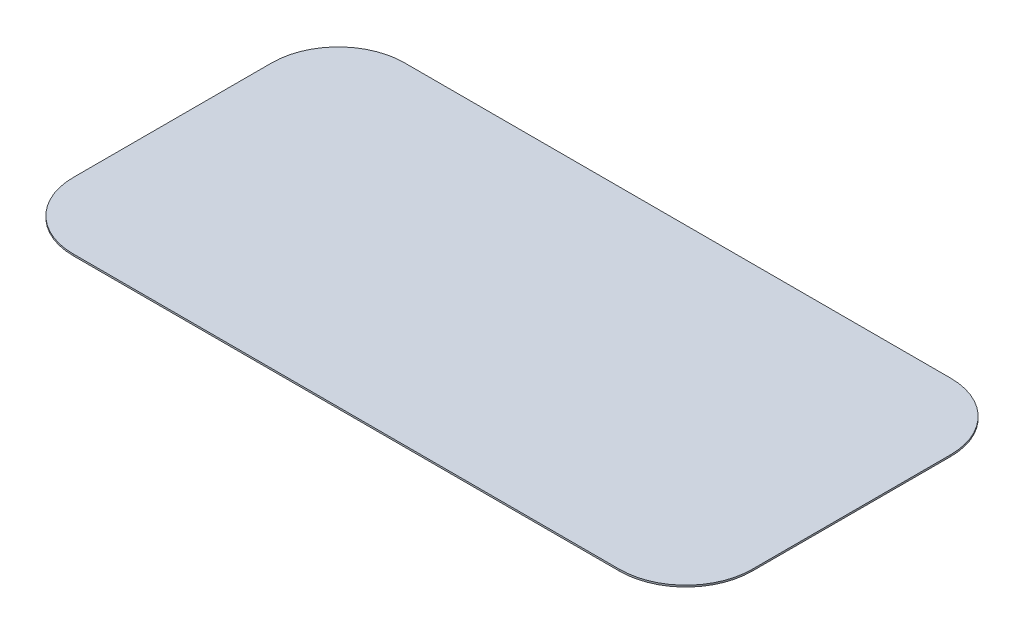
ISO-10303-21;
HEADER;
FILE_DESCRIPTION(('STEP AP214'),'2;1');
FILE_NAME('part.step','',(''),(''),'','','');
FILE_SCHEMA(('AUTOMOTIVE_DESIGN { 1 0 10303 214 1 1 1 1 }'));
ENDSEC;
DATA;
#1=APPLICATION_CONTEXT('core data for automotive mechanical design processes');
#2=APPLICATION_PROTOCOL_DEFINITION('international standard','automotive_design',2000,#1);
#3=PRODUCT_CONTEXT('',#1,'mechanical');
#4=PRODUCT('Part','Part','',(#3));
#5=PRODUCT_RELATED_PRODUCT_CATEGORY('part','',(#4));
#6=PRODUCT_DEFINITION_FORMATION('','',#4);
#7=PRODUCT_DEFINITION_CONTEXT('part definition',#1,'design');
#8=PRODUCT_DEFINITION('design','',#6,#7);
#9=PRODUCT_DEFINITION_SHAPE('','',#8);
#10=(LENGTH_UNIT() NAMED_UNIT(*) SI_UNIT(.MILLI.,.METRE.));
#11=(NAMED_UNIT(*) PLANE_ANGLE_UNIT() SI_UNIT($,.RADIAN.));
#12=(NAMED_UNIT(*) SI_UNIT($,.STERADIAN.) SOLID_ANGLE_UNIT());
#13=UNCERTAINTY_MEASURE_WITH_UNIT(LENGTH_MEASURE(1.E-05),#10,'distance_accuracy_value','');
#14=(GEOMETRIC_REPRESENTATION_CONTEXT(3) GLOBAL_UNCERTAINTY_ASSIGNED_CONTEXT((#13)) GLOBAL_UNIT_ASSIGNED_CONTEXT((#10,
#11,#12)) REPRESENTATION_CONTEXT('',''));
#15=CARTESIAN_POINT('',(0.,0.,0.));
#16=DIRECTION('',(0.,0.,1.));
#17=DIRECTION('',(1.,0.,0.));
#18=AXIS2_PLACEMENT_3D('',#15,#16,#17);
#19=CARTESIAN_POINT('',(0.,0.05,0.));
#20=DIRECTION('',(1.,0.,0.));
#21=DIRECTION('',(0.,0.,-1.));
#22=AXIS2_PLACEMENT_3D('',#19,#20,#21);
#23=PLANE('',#22);
#24=DIRECTION('',(0.,0.,1.));
#25=VECTOR('',#24,1.);
#26=CARTESIAN_POINT('',(0.,0.05,0.));
#27=LINE('',#26,#25);
#28=CARTESIAN_POINT('',(0.,0.05,-8.));
#29=VERTEX_POINT('',#28);
#30=CARTESIAN_POINT('',(0.,0.05,-2.));
#31=VERTEX_POINT('',#30);
#32=EDGE_CURVE('E120',#29,#31,#27,.T.);
#33=ORIENTED_EDGE('',*,*,#32,.F.);
#34=DIRECTION('',(0.,-1.,0.));
#35=VECTOR('',#34,1.);
#36=CARTESIAN_POINT('',(0.,0.05,-8.));
#37=LINE('',#36,#35);
#38=CARTESIAN_POINT('',(0.,0.,-8.));
#39=VERTEX_POINT('',#38);
#40=EDGE_CURVE('E105',#29,#39,#37,.T.);
#41=ORIENTED_EDGE('',*,*,#40,.T.);
#42=DIRECTION('',(0.,0.,1.));
#43=VECTOR('',#42,1.);
#44=CARTESIAN_POINT('',(0.,0.,0.));
#45=LINE('',#44,#43);
#46=CARTESIAN_POINT('',(0.,0.,-2.));
#47=VERTEX_POINT('',#46);
#48=EDGE_CURVE('E117',#39,#47,#45,.T.);
#49=ORIENTED_EDGE('',*,*,#48,.T.);
#50=DIRECTION('',(0.,-1.,0.));
#51=VECTOR('',#50,1.);
#52=CARTESIAN_POINT('',(0.,0.05,-2.));
#53=LINE('',#52,#51);
#54=EDGE_CURVE('E122',#47,#31,#53,.F.);
#55=ORIENTED_EDGE('',*,*,#54,.T.);
#56=EDGE_LOOP('',(#33,#41,#49,#55));
#57=FACE_BOUND('',#56,.T.);
#58=ADVANCED_FACE('F35',(#57),#23,.F.);
#59=CARTESIAN_POINT('',(0.,0.05,0.));
#60=DIRECTION('',(0.,0.,-1.));
#61=DIRECTION('',(-1.,0.,0.));
#62=AXIS2_PLACEMENT_3D('',#59,#60,#61);
#63=PLANE('',#62);
#64=DIRECTION('',(1.,0.,0.));
#65=VECTOR('',#64,1.);
#66=CARTESIAN_POINT('',(0.,0.05,0.));
#67=LINE('',#66,#65);
#68=CARTESIAN_POINT('',(2.,0.05,0.));
#69=VERTEX_POINT('',#68);
#70=CARTESIAN_POINT('',(18.5,0.05,0.));
#71=VERTEX_POINT('',#70);
#72=EDGE_CURVE('E162',#69,#71,#67,.T.);
#73=ORIENTED_EDGE('',*,*,#72,.F.);
#74=DIRECTION('',(0.,-1.,0.));
#75=VECTOR('',#74,1.);
#76=CARTESIAN_POINT('',(2.,0.05,0.));
#77=LINE('',#76,#75);
#78=CARTESIAN_POINT('',(2.,0.,0.));
#79=VERTEX_POINT('',#78);
#80=EDGE_CURVE('E155',#69,#79,#77,.T.);
#81=ORIENTED_EDGE('',*,*,#80,.T.);
#82=DIRECTION('',(1.,0.,0.));
#83=VECTOR('',#82,1.);
#84=CARTESIAN_POINT('',(0.,0.,0.));
#85=LINE('',#84,#83);
#86=CARTESIAN_POINT('',(18.5,0.,0.));
#87=VERTEX_POINT('',#86);
#88=EDGE_CURVE('E126',#79,#87,#85,.T.);
#89=ORIENTED_EDGE('',*,*,#88,.T.);
#90=DIRECTION('',(0.,-1.,0.));
#91=VECTOR('',#90,1.);
#92=CARTESIAN_POINT('',(18.5,0.05,0.));
#93=LINE('',#92,#91);
#94=EDGE_CURVE('E153',#87,#71,#93,.F.);
#95=ORIENTED_EDGE('',*,*,#94,.T.);
#96=EDGE_LOOP('',(#73,#81,#89,#95));
#97=FACE_BOUND('',#96,.T.);
#98=ADVANCED_FACE('F160',(#97),#63,.F.);
#99=CARTESIAN_POINT('',(20.5,0.05,0.));
#100=DIRECTION('',(-1.,0.,0.));
#101=DIRECTION('',(0.,0.,1.));
#102=AXIS2_PLACEMENT_3D('',#99,#100,#101);
#103=PLANE('',#102);
#104=DIRECTION('',(0.,0.,-1.));
#105=VECTOR('',#104,1.);
#106=CARTESIAN_POINT('',(20.5,0.05,0.));
#107=LINE('',#106,#105);
#108=CARTESIAN_POINT('',(20.5,0.05,-2.));
#109=VERTEX_POINT('',#108);
#110=CARTESIAN_POINT('',(20.5,0.05,-8.));
#111=VERTEX_POINT('',#110);
#112=EDGE_CURVE('E170',#109,#111,#107,.T.);
#113=ORIENTED_EDGE('',*,*,#112,.F.);
#114=DIRECTION('',(0.,-1.,0.));
#115=VECTOR('',#114,1.);
#116=CARTESIAN_POINT('',(20.5,0.05,-2.));
#117=LINE('',#116,#115);
#118=CARTESIAN_POINT('',(20.5,0.,-2.));
#119=VERTEX_POINT('',#118);
#120=EDGE_CURVE('E11',#109,#119,#117,.T.);
#121=ORIENTED_EDGE('',*,*,#120,.T.);
#122=DIRECTION('',(0.,0.,-1.));
#123=VECTOR('',#122,1.);
#124=CARTESIAN_POINT('',(20.5,0.,0.));
#125=LINE('',#124,#123);
#126=CARTESIAN_POINT('',(20.5,0.,-8.));
#127=VERTEX_POINT('',#126);
#128=EDGE_CURVE('E129',#119,#127,#125,.T.);
#129=ORIENTED_EDGE('',*,*,#128,.T.);
#130=DIRECTION('',(0.,-1.,0.));
#131=VECTOR('',#130,1.);
#132=CARTESIAN_POINT('',(20.5,0.05,-8.));
#133=LINE('',#132,#131);
#134=EDGE_CURVE('E43',#127,#111,#133,.F.);
#135=ORIENTED_EDGE('',*,*,#134,.T.);
#136=EDGE_LOOP('',(#113,#121,#129,#135));
#137=FACE_BOUND('',#136,.T.);
#138=ADVANCED_FACE('F169',(#137),#103,.F.);
#139=CARTESIAN_POINT('',(0.,0.05,-10.));
#140=DIRECTION('',(0.,0.,1.));
#141=DIRECTION('',(1.,0.,0.));
#142=AXIS2_PLACEMENT_3D('',#139,#140,#141);
#143=PLANE('',#142);
#144=DIRECTION('',(-1.,0.,0.));
#145=VECTOR('',#144,1.);
#146=CARTESIAN_POINT('',(0.,0.,-10.));
#147=LINE('',#146,#145);
#148=CARTESIAN_POINT('',(18.5,0.,-10.));
#149=VERTEX_POINT('',#148);
#150=CARTESIAN_POINT('',(1.99999999999999,0.,-10.));
#151=VERTEX_POINT('',#150);
#152=EDGE_CURVE('E136',#149,#151,#147,.T.);
#153=ORIENTED_EDGE('',*,*,#152,.T.);
#154=DIRECTION('',(0.,-1.,0.));
#155=VECTOR('',#154,1.);
#156=CARTESIAN_POINT('',(2.,0.05,-10.));
#157=LINE('',#156,#155);
#158=CARTESIAN_POINT('',(1.99999999999999,0.05,-10.));
#159=VERTEX_POINT('',#158);
#160=EDGE_CURVE('E106',#151,#159,#157,.F.);
#161=ORIENTED_EDGE('',*,*,#160,.T.);
#162=DIRECTION('',(-1.,0.,0.));
#163=VECTOR('',#162,1.);
#164=CARTESIAN_POINT('',(0.,0.05,-10.));
#165=LINE('',#164,#163);
#166=CARTESIAN_POINT('',(18.5,0.05,-10.));
#167=VERTEX_POINT('',#166);
#168=EDGE_CURVE('E132',#167,#159,#165,.T.);
#169=ORIENTED_EDGE('',*,*,#168,.F.);
#170=DIRECTION('',(0.,-1.,0.));
#171=VECTOR('',#170,1.);
#172=CARTESIAN_POINT('',(18.5,0.05,-10.));
#173=LINE('',#172,#171);
#174=EDGE_CURVE('E111',#167,#149,#173,.T.);
#175=ORIENTED_EDGE('',*,*,#174,.T.);
#176=EDGE_LOOP('',(#153,#161,#169,#175));
#177=FACE_BOUND('',#176,.T.);
#178=ADVANCED_FACE('F193',(#177),#143,.F.);
#179=CARTESIAN_POINT('',(0.,0.05,0.));
#180=DIRECTION('',(0.,-1.,0.));
#181=DIRECTION('',(0.,0.,-1.));
#182=AXIS2_PLACEMENT_3D('',#179,#180,#181);
#183=PLANE('',#182);
#184=ORIENTED_EDGE('',*,*,#168,.T.);
#185=CARTESIAN_POINT('',(2.,0.05,-8.));
#186=DIRECTION('',(0.,-1.,0.));
#187=DIRECTION('',(0.,0.,-1.));
#188=AXIS2_PLACEMENT_3D('',#185,#186,#187);
#189=CIRCLE('',#188,2.);
#190=EDGE_CURVE('E151',#159,#29,#189,.F.);
#191=ORIENTED_EDGE('',*,*,#190,.T.);
#192=ORIENTED_EDGE('',*,*,#32,.T.);
#193=CARTESIAN_POINT('',(2.,0.05,-2.));
#194=DIRECTION('',(0.,-1.,0.));
#195=DIRECTION('',(0.,0.,-1.));
#196=AXIS2_PLACEMENT_3D('',#193,#194,#195);
#197=CIRCLE('',#196,2.);
#198=EDGE_CURVE('E149',#31,#69,#197,.F.);
#199=ORIENTED_EDGE('',*,*,#198,.T.);
#200=ORIENTED_EDGE('',*,*,#72,.T.);
#201=CARTESIAN_POINT('',(18.5,0.05,-2.));
#202=DIRECTION('',(0.,-1.,0.));
#203=DIRECTION('',(0.,0.,-1.));
#204=AXIS2_PLACEMENT_3D('',#201,#202,#203);
#205=CIRCLE('',#204,2.);
#206=EDGE_CURVE('E56',#71,#109,#205,.F.);
#207=ORIENTED_EDGE('',*,*,#206,.T.);
#208=ORIENTED_EDGE('',*,*,#112,.T.);
#209=CARTESIAN_POINT('',(18.5,0.05,-8.));
#210=DIRECTION('',(0.,-1.,0.));
#211=DIRECTION('',(0.,0.,-1.));
#212=AXIS2_PLACEMENT_3D('',#209,#210,#211);
#213=CIRCLE('',#212,2.);
#214=EDGE_CURVE('E146',#111,#167,#213,.F.);
#215=ORIENTED_EDGE('',*,*,#214,.T.);
#216=EDGE_LOOP('',(#184,#191,#192,#199,#200,#207,#208,#215));
#217=FACE_BOUND('',#216,.T.);
#218=ADVANCED_FACE('F175',(#217),#183,.F.);
#219=CARTESIAN_POINT('',(0.,0.,0.));
#220=DIRECTION('',(0.,-1.,0.));
#221=DIRECTION('',(0.,0.,-1.));
#222=AXIS2_PLACEMENT_3D('',#219,#220,#221);
#223=PLANE('',#222);
#224=ORIENTED_EDGE('',*,*,#48,.F.);
#225=CARTESIAN_POINT('',(2.,0.,-8.));
#226=DIRECTION('',(0.,-1.,0.));
#227=DIRECTION('',(0.,0.,-1.));
#228=AXIS2_PLACEMENT_3D('',#225,#226,#227);
#229=CIRCLE('',#228,2.);
#230=EDGE_CURVE('E101',#39,#151,#229,.T.);
#231=ORIENTED_EDGE('',*,*,#230,.T.);
#232=ORIENTED_EDGE('',*,*,#152,.F.);
#233=CARTESIAN_POINT('',(18.5,0.,-8.));
#234=DIRECTION('',(0.,-1.,0.));
#235=DIRECTION('',(0.,0.,-1.));
#236=AXIS2_PLACEMENT_3D('',#233,#234,#235);
#237=CIRCLE('',#236,2.);
#238=EDGE_CURVE('E121',#149,#127,#237,.T.);
#239=ORIENTED_EDGE('',*,*,#238,.T.);
#240=ORIENTED_EDGE('',*,*,#128,.F.);
#241=CARTESIAN_POINT('',(18.5,0.,-2.));
#242=DIRECTION('',(0.,-1.,0.));
#243=DIRECTION('',(0.,0.,-1.));
#244=AXIS2_PLACEMENT_3D('',#241,#242,#243);
#245=CIRCLE('',#244,2.);
#246=EDGE_CURVE('E140',#119,#87,#245,.T.);
#247=ORIENTED_EDGE('',*,*,#246,.T.);
#248=ORIENTED_EDGE('',*,*,#88,.F.);
#249=CARTESIAN_POINT('',(2.,0.,-2.));
#250=DIRECTION('',(0.,-1.,0.));
#251=DIRECTION('',(0.,0.,-1.));
#252=AXIS2_PLACEMENT_3D('',#249,#250,#251);
#253=CIRCLE('',#252,2.);
#254=EDGE_CURVE('E112',#79,#47,#253,.T.);
#255=ORIENTED_EDGE('',*,*,#254,.T.);
#256=EDGE_LOOP('',(#224,#231,#232,#239,#240,#247,#248,#255));
#257=FACE_BOUND('',#256,.T.);
#258=ADVANCED_FACE('F124',(#257),#223,.T.);
#259=CARTESIAN_POINT('',(2.,0.05,-8.));
#260=DIRECTION('',(0.,-1.,0.));
#261=DIRECTION('',(0.,0.,-1.));
#262=AXIS2_PLACEMENT_3D('',#259,#260,#261);
#263=CYLINDRICAL_SURFACE('',#262,2.);
#264=ORIENTED_EDGE('',*,*,#190,.F.);
#265=ORIENTED_EDGE('',*,*,#160,.F.);
#266=ORIENTED_EDGE('',*,*,#230,.F.);
#267=ORIENTED_EDGE('',*,*,#40,.F.);
#268=EDGE_LOOP('',(#264,#265,#266,#267));
#269=FACE_BOUND('',#268,.T.);
#270=ADVANCED_FACE('F104',(#269),#263,.T.);
#271=CARTESIAN_POINT('',(2.,0.05,-2.));
#272=DIRECTION('',(0.,-1.,0.));
#273=DIRECTION('',(0.,0.,-1.));
#274=AXIS2_PLACEMENT_3D('',#271,#272,#273);
#275=CYLINDRICAL_SURFACE('',#274,2.);
#276=ORIENTED_EDGE('',*,*,#198,.F.);
#277=ORIENTED_EDGE('',*,*,#54,.F.);
#278=ORIENTED_EDGE('',*,*,#254,.F.);
#279=ORIENTED_EDGE('',*,*,#80,.F.);
#280=EDGE_LOOP('',(#276,#277,#278,#279));
#281=FACE_BOUND('',#280,.T.);
#282=ADVANCED_FACE('F176',(#281),#275,.T.);
#283=CARTESIAN_POINT('',(18.5,0.05,-2.));
#284=DIRECTION('',(0.,-1.,0.));
#285=DIRECTION('',(0.,0.,-1.));
#286=AXIS2_PLACEMENT_3D('',#283,#284,#285);
#287=CYLINDRICAL_SURFACE('',#286,2.);
#288=ORIENTED_EDGE('',*,*,#206,.F.);
#289=ORIENTED_EDGE('',*,*,#94,.F.);
#290=ORIENTED_EDGE('',*,*,#246,.F.);
#291=ORIENTED_EDGE('',*,*,#120,.F.);
#292=EDGE_LOOP('',(#288,#289,#290,#291));
#293=FACE_BOUND('',#292,.T.);
#294=ADVANCED_FACE('F168',(#293),#287,.T.);
#295=CARTESIAN_POINT('',(18.5,0.05,-8.));
#296=DIRECTION('',(0.,-1.,0.));
#297=DIRECTION('',(0.,0.,-1.));
#298=AXIS2_PLACEMENT_3D('',#295,#296,#297);
#299=CYLINDRICAL_SURFACE('',#298,2.);
#300=ORIENTED_EDGE('',*,*,#214,.F.);
#301=ORIENTED_EDGE('',*,*,#134,.F.);
#302=ORIENTED_EDGE('',*,*,#238,.F.);
#303=ORIENTED_EDGE('',*,*,#174,.F.);
#304=EDGE_LOOP('',(#300,#301,#302,#303));
#305=FACE_BOUND('',#304,.T.);
#306=ADVANCED_FACE('F37',(#305),#299,.T.);
#307=CLOSED_SHELL('',(#58,#98,#138,#178,#218,#258,#270,#282,#294,#306));
#308=MANIFOLD_SOLID_BREP('B2',#307);
#309=ADVANCED_BREP_SHAPE_REPRESENTATION('',(#18,#308),#14);
#310=SHAPE_DEFINITION_REPRESENTATION(#9,#309);
ENDSEC;
END-ISO-10303-21;
